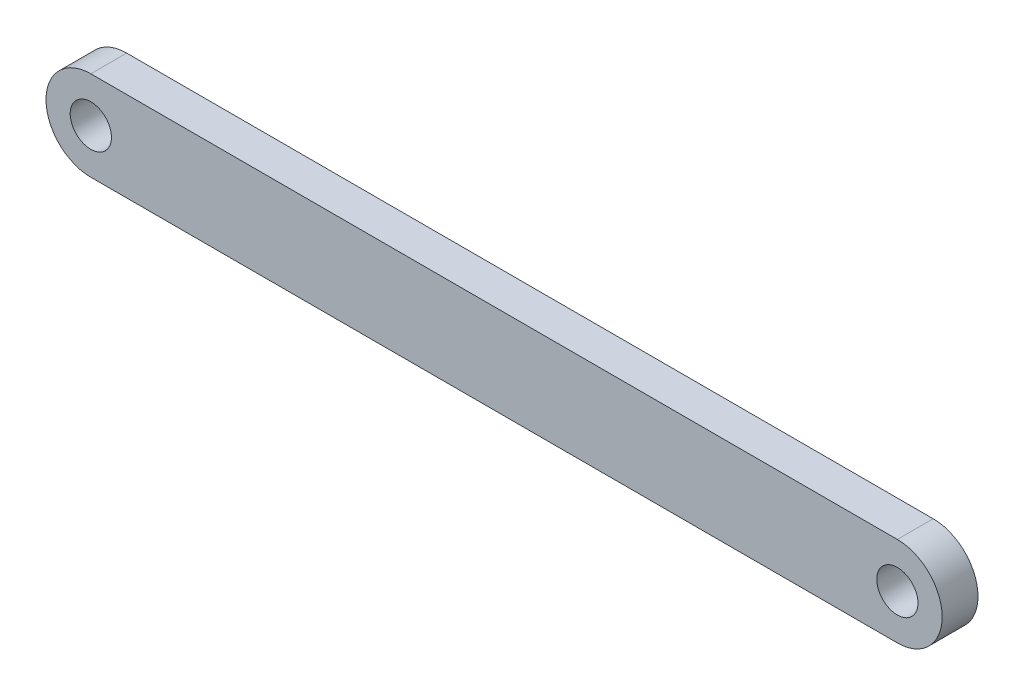
ISO-10303-21;
HEADER;
FILE_DESCRIPTION(('STEP AP214'),'2;1');
FILE_NAME('part.step','',(''),(''),'','','');
FILE_SCHEMA(('AUTOMOTIVE_DESIGN { 1 0 10303 214 1 1 1 1 }'));
ENDSEC;
DATA;
#1=APPLICATION_CONTEXT('core data for automotive mechanical design processes');
#2=APPLICATION_PROTOCOL_DEFINITION('international standard','automotive_design',2000,#1);
#3=PRODUCT_CONTEXT('',#1,'mechanical');
#4=PRODUCT('Part','Part','',(#3));
#5=PRODUCT_RELATED_PRODUCT_CATEGORY('part','',(#4));
#6=PRODUCT_DEFINITION_FORMATION('','',#4);
#7=PRODUCT_DEFINITION_CONTEXT('part definition',#1,'design');
#8=PRODUCT_DEFINITION('design','',#6,#7);
#9=PRODUCT_DEFINITION_SHAPE('','',#8);
#10=(LENGTH_UNIT() NAMED_UNIT(*) SI_UNIT(.MILLI.,.METRE.));
#11=(NAMED_UNIT(*) PLANE_ANGLE_UNIT() SI_UNIT($,.RADIAN.));
#12=(NAMED_UNIT(*) SI_UNIT($,.STERADIAN.) SOLID_ANGLE_UNIT());
#13=UNCERTAINTY_MEASURE_WITH_UNIT(LENGTH_MEASURE(1.E-05),#10,'distance_accuracy_value','');
#14=(GEOMETRIC_REPRESENTATION_CONTEXT(3) GLOBAL_UNCERTAINTY_ASSIGNED_CONTEXT((#13)) GLOBAL_UNIT_ASSIGNED_CONTEXT((#10,
#11,#12)) REPRESENTATION_CONTEXT('',''));
#15=CARTESIAN_POINT('',(0.,0.,0.));
#16=DIRECTION('',(0.,0.,1.));
#17=DIRECTION('',(1.,0.,0.));
#18=AXIS2_PLACEMENT_3D('',#15,#16,#17);
#19=CARTESIAN_POINT('',(0.,2.5,2.));
#20=DIRECTION('',(0.,-1.,0.));
#21=DIRECTION('',(0.,0.,-1.));
#22=AXIS2_PLACEMENT_3D('',#19,#20,#21);
#23=PLANE('',#22);
#24=DIRECTION('',(-1.,0.,0.));
#25=VECTOR('',#24,1.);
#26=CARTESIAN_POINT('',(0.,2.5,0.));
#27=LINE('',#26,#25);
#28=CARTESIAN_POINT('',(45.,2.5,0.));
#29=VERTEX_POINT('',#28);
#30=CARTESIAN_POINT('',(0.,2.5,0.));
#31=VERTEX_POINT('',#30);
#32=EDGE_CURVE('E128',#29,#31,#27,.T.);
#33=ORIENTED_EDGE('',*,*,#32,.T.);
#34=DIRECTION('',(0.,0.,-1.));
#35=VECTOR('',#34,1.);
#36=CARTESIAN_POINT('',(0.,2.5,2.));
#37=LINE('',#36,#35);
#38=CARTESIAN_POINT('',(0.,2.5,2.));
#39=VERTEX_POINT('',#38);
#40=EDGE_CURVE('E85',#39,#31,#37,.T.);
#41=ORIENTED_EDGE('',*,*,#40,.F.);
#42=DIRECTION('',(-1.,0.,0.));
#43=VECTOR('',#42,1.);
#44=CARTESIAN_POINT('',(0.,2.5,2.));
#45=LINE('',#44,#43);
#46=CARTESIAN_POINT('',(45.,2.5,2.));
#47=VERTEX_POINT('',#46);
#48=EDGE_CURVE('E122',#47,#39,#45,.T.);
#49=ORIENTED_EDGE('',*,*,#48,.F.);
#50=DIRECTION('',(0.,0.,-1.));
#51=VECTOR('',#50,1.);
#52=CARTESIAN_POINT('',(45.,2.5,2.));
#53=LINE('',#52,#51);
#54=EDGE_CURVE('E11',#47,#29,#53,.T.);
#55=ORIENTED_EDGE('',*,*,#54,.T.);
#56=EDGE_LOOP('',(#33,#41,#49,#55));
#57=FACE_BOUND('',#56,.T.);
#58=ADVANCED_FACE('F17',(#57),#23,.F.);
#59=CARTESIAN_POINT('',(45.,0.,2.));
#60=DIRECTION('',(0.,0.,-1.));
#61=DIRECTION('',(-1.,0.,0.));
#62=AXIS2_PLACEMENT_3D('',#59,#60,#61);
#63=CYLINDRICAL_SURFACE('',#62,2.5);
#64=CARTESIAN_POINT('',(45.,0.,0.));
#65=DIRECTION('',(0.,0.,1.));
#66=DIRECTION('',(1.,0.,0.));
#67=AXIS2_PLACEMENT_3D('',#64,#65,#66);
#68=CIRCLE('',#67,2.5);
#69=CARTESIAN_POINT('',(45.,-2.5,0.));
#70=VERTEX_POINT('',#69);
#71=EDGE_CURVE('E78',#70,#29,#68,.T.);
#72=ORIENTED_EDGE('',*,*,#71,.T.);
#73=ORIENTED_EDGE('',*,*,#54,.F.);
#74=CARTESIAN_POINT('',(45.,0.,2.));
#75=DIRECTION('',(0.,0.,1.));
#76=DIRECTION('',(1.,0.,0.));
#77=AXIS2_PLACEMENT_3D('',#74,#75,#76);
#78=CIRCLE('',#77,2.5);
#79=CARTESIAN_POINT('',(45.,-2.5,2.));
#80=VERTEX_POINT('',#79);
#81=EDGE_CURVE('E120',#80,#47,#78,.T.);
#82=ORIENTED_EDGE('',*,*,#81,.F.);
#83=DIRECTION('',(0.,0.,-1.));
#84=VECTOR('',#83,1.);
#85=CARTESIAN_POINT('',(45.,-2.5,2.));
#86=LINE('',#85,#84);
#87=EDGE_CURVE('E25',#80,#70,#86,.T.);
#88=ORIENTED_EDGE('',*,*,#87,.T.);
#89=EDGE_LOOP('',(#72,#73,#82,#88));
#90=FACE_BOUND('',#89,.T.);
#91=ADVANCED_FACE('F281',(#90),#63,.T.);
#92=CARTESIAN_POINT('',(0.,-2.5,2.));
#93=DIRECTION('',(0.,1.,0.));
#94=DIRECTION('',(1.,0.,0.));
#95=AXIS2_PLACEMENT_3D('',#92,#93,#94);
#96=PLANE('',#95);
#97=DIRECTION('',(1.,0.,0.));
#98=VECTOR('',#97,1.);
#99=CARTESIAN_POINT('',(0.,-2.5,0.));
#100=LINE('',#99,#98);
#101=CARTESIAN_POINT('',(0.,-2.5,0.));
#102=VERTEX_POINT('',#101);
#103=EDGE_CURVE('E71',#102,#70,#100,.T.);
#104=ORIENTED_EDGE('',*,*,#103,.T.);
#105=ORIENTED_EDGE('',*,*,#87,.F.);
#106=DIRECTION('',(1.,0.,0.));
#107=VECTOR('',#106,1.);
#108=CARTESIAN_POINT('',(0.,-2.5,2.));
#109=LINE('',#108,#107);
#110=CARTESIAN_POINT('',(0.,-2.5,2.));
#111=VERTEX_POINT('',#110);
#112=EDGE_CURVE('E86',#111,#80,#109,.T.);
#113=ORIENTED_EDGE('',*,*,#112,.F.);
#114=DIRECTION('',(0.,0.,-1.));
#115=VECTOR('',#114,1.);
#116=CARTESIAN_POINT('',(0.,-2.5,2.));
#117=LINE('',#116,#115);
#118=EDGE_CURVE('E84',#111,#102,#117,.T.);
#119=ORIENTED_EDGE('',*,*,#118,.T.);
#120=EDGE_LOOP('',(#104,#105,#113,#119));
#121=FACE_BOUND('',#120,.T.);
#122=ADVANCED_FACE('F88',(#121),#96,.F.);
#123=CARTESIAN_POINT('',(0.,0.,0.));
#124=DIRECTION('',(0.,0.,1.));
#125=DIRECTION('',(1.,0.,0.));
#126=AXIS2_PLACEMENT_3D('',#123,#124,#125);
#127=PLANE('',#126);
#128=CARTESIAN_POINT('',(0.,0.,0.));
#129=DIRECTION('',(0.,0.,1.));
#130=DIRECTION('',(1.,0.,0.));
#131=AXIS2_PLACEMENT_3D('',#128,#129,#130);
#132=CIRCLE('',#131,1.15);
#133=CARTESIAN_POINT('',(1.15,0.,0.));
#134=VERTEX_POINT('',#133);
#135=EDGE_CURVE('E110',#134,#134,#132,.T.);
#136=ORIENTED_EDGE('',*,*,#135,.T.);
#137=EDGE_LOOP('',(#136));
#138=FACE_BOUND('',#137,.T.);
#139=CARTESIAN_POINT('',(45.,0.,0.));
#140=DIRECTION('',(0.,0.,1.));
#141=DIRECTION('',(1.,0.,0.));
#142=AXIS2_PLACEMENT_3D('',#139,#140,#141);
#143=CIRCLE('',#142,1.15);
#144=CARTESIAN_POINT('',(46.15,0.,0.));
#145=VERTEX_POINT('',#144);
#146=EDGE_CURVE('E105',#145,#145,#143,.T.);
#147=ORIENTED_EDGE('',*,*,#146,.T.);
#148=EDGE_LOOP('',(#147));
#149=FACE_BOUND('',#148,.T.);
#150=CARTESIAN_POINT('',(0.,0.,0.));
#151=DIRECTION('',(0.,0.,1.));
#152=DIRECTION('',(1.,0.,0.));
#153=AXIS2_PLACEMENT_3D('',#150,#151,#152);
#154=CIRCLE('',#153,2.5);
#155=EDGE_CURVE('E80',#31,#102,#154,.T.);
#156=ORIENTED_EDGE('',*,*,#155,.F.);
#157=ORIENTED_EDGE('',*,*,#32,.F.);
#158=ORIENTED_EDGE('',*,*,#71,.F.);
#159=ORIENTED_EDGE('',*,*,#103,.F.);
#160=EDGE_LOOP('',(#156,#157,#158,#159));
#161=FACE_BOUND('',#160,.T.);
#162=ADVANCED_FACE('F72',(#138,#149,#161),#127,.F.);
#163=CARTESIAN_POINT('',(0.,0.,2.));
#164=DIRECTION('',(0.,0.,1.));
#165=DIRECTION('',(1.,0.,0.));
#166=AXIS2_PLACEMENT_3D('',#163,#164,#165);
#167=PLANE('',#166);
#168=CARTESIAN_POINT('',(0.,0.,2.));
#169=DIRECTION('',(0.,0.,1.));
#170=DIRECTION('',(1.,0.,0.));
#171=AXIS2_PLACEMENT_3D('',#168,#169,#170);
#172=CIRCLE('',#171,1.15);
#173=CARTESIAN_POINT('',(1.15,0.,2.));
#174=VERTEX_POINT('',#173);
#175=EDGE_CURVE('E106',#174,#174,#172,.T.);
#176=ORIENTED_EDGE('',*,*,#175,.F.);
#177=EDGE_LOOP('',(#176));
#178=FACE_BOUND('',#177,.T.);
#179=CARTESIAN_POINT('',(45.,0.,2.));
#180=DIRECTION('',(0.,0.,1.));
#181=DIRECTION('',(1.,0.,0.));
#182=AXIS2_PLACEMENT_3D('',#179,#180,#181);
#183=CIRCLE('',#182,1.15);
#184=CARTESIAN_POINT('',(46.15,0.,2.));
#185=VERTEX_POINT('',#184);
#186=EDGE_CURVE('E112',#185,#185,#183,.T.);
#187=ORIENTED_EDGE('',*,*,#186,.F.);
#188=EDGE_LOOP('',(#187));
#189=FACE_BOUND('',#188,.T.);
#190=ORIENTED_EDGE('',*,*,#48,.T.);
#191=CARTESIAN_POINT('',(0.,0.,2.));
#192=DIRECTION('',(0.,0.,1.));
#193=DIRECTION('',(1.,0.,0.));
#194=AXIS2_PLACEMENT_3D('',#191,#192,#193);
#195=CIRCLE('',#194,2.5);
#196=EDGE_CURVE('E96',#39,#111,#195,.T.);
#197=ORIENTED_EDGE('',*,*,#196,.T.);
#198=ORIENTED_EDGE('',*,*,#112,.T.);
#199=ORIENTED_EDGE('',*,*,#81,.T.);
#200=EDGE_LOOP('',(#190,#197,#198,#199));
#201=FACE_BOUND('',#200,.T.);
#202=ADVANCED_FACE('F247',(#178,#189,#201),#167,.T.);
#203=CARTESIAN_POINT('',(0.,0.,2.));
#204=DIRECTION('',(0.,0.,-1.));
#205=DIRECTION('',(-1.,0.,0.));
#206=AXIS2_PLACEMENT_3D('',#203,#204,#205);
#207=CYLINDRICAL_SURFACE('',#206,2.5);
#208=ORIENTED_EDGE('',*,*,#196,.F.);
#209=ORIENTED_EDGE('',*,*,#40,.T.);
#210=ORIENTED_EDGE('',*,*,#155,.T.);
#211=ORIENTED_EDGE('',*,*,#118,.F.);
#212=EDGE_LOOP('',(#208,#209,#210,#211));
#213=FACE_BOUND('',#212,.T.);
#214=ADVANCED_FACE('F91',(#213),#207,.T.);
#215=CARTESIAN_POINT('',(45.,0.,2.));
#216=DIRECTION('',(0.,0.,-1.));
#217=DIRECTION('',(-1.,0.,0.));
#218=AXIS2_PLACEMENT_3D('',#215,#216,#217);
#219=CYLINDRICAL_SURFACE('',#218,1.15);
#220=ORIENTED_EDGE('',*,*,#146,.F.);
#221=EDGE_LOOP('',(#220));
#222=FACE_BOUND('',#221,.T.);
#223=ORIENTED_EDGE('',*,*,#186,.T.);
#224=EDGE_LOOP('',(#223));
#225=FACE_BOUND('',#224,.T.);
#226=ADVANCED_FACE('F241',(#222,#225),#219,.F.);
#227=CARTESIAN_POINT('',(0.,0.,2.));
#228=DIRECTION('',(0.,0.,-1.));
#229=DIRECTION('',(-1.,0.,0.));
#230=AXIS2_PLACEMENT_3D('',#227,#228,#229);
#231=CYLINDRICAL_SURFACE('',#230,1.15);
#232=ORIENTED_EDGE('',*,*,#135,.F.);
#233=EDGE_LOOP('',(#232));
#234=FACE_BOUND('',#233,.T.);
#235=ORIENTED_EDGE('',*,*,#175,.T.);
#236=EDGE_LOOP('',(#235));
#237=FACE_BOUND('',#236,.T.);
#238=ADVANCED_FACE('F236',(#234,#237),#231,.F.);
#239=CLOSED_SHELL('',(#58,#91,#122,#162,#202,#214,#226,#238));
#240=MANIFOLD_SOLID_BREP('B1',#239);
#241=ADVANCED_BREP_SHAPE_REPRESENTATION('',(#18,#240),#14);
#242=SHAPE_DEFINITION_REPRESENTATION(#9,#241);
ENDSEC;
END-ISO-10303-21;
